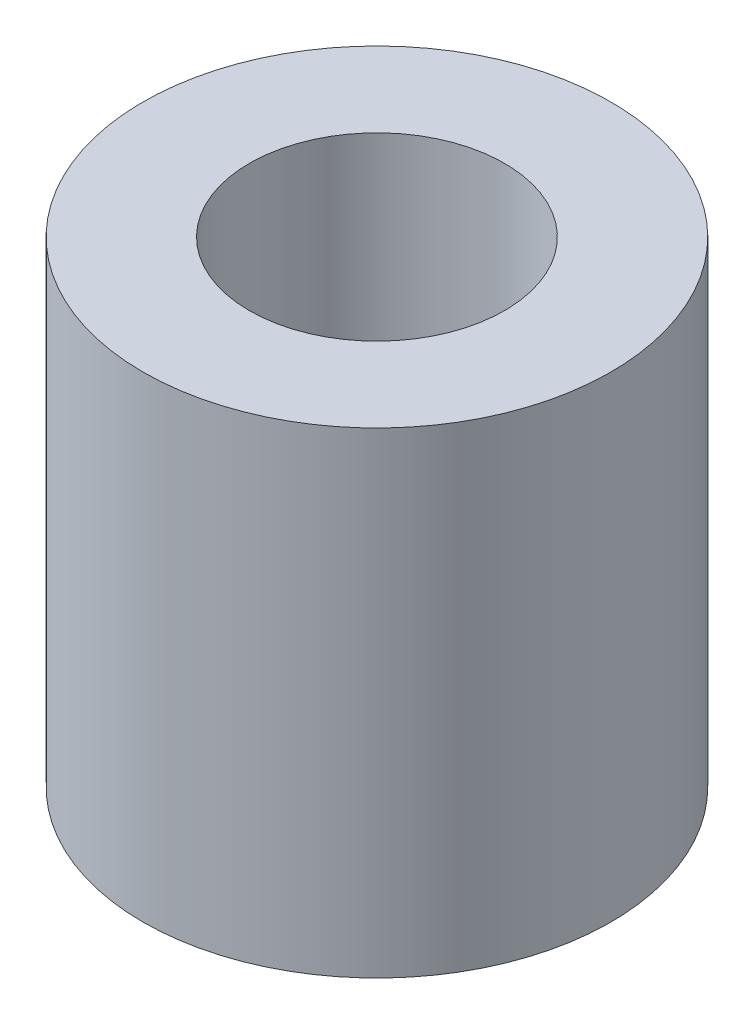
ISO-10303-21;
HEADER;
FILE_DESCRIPTION(('STEP AP214'),'2;1');
FILE_NAME('part.step','',(''),(''),'','','');
FILE_SCHEMA(('AUTOMOTIVE_DESIGN { 1 0 10303 214 1 1 1 1 }'));
ENDSEC;
DATA;
#1=APPLICATION_CONTEXT('core data for automotive mechanical design processes');
#2=APPLICATION_PROTOCOL_DEFINITION('international standard','automotive_design',2000,#1);
#3=PRODUCT_CONTEXT('',#1,'mechanical');
#4=PRODUCT('Part','Part','',(#3));
#5=PRODUCT_RELATED_PRODUCT_CATEGORY('part','',(#4));
#6=PRODUCT_DEFINITION_FORMATION('','',#4);
#7=PRODUCT_DEFINITION_CONTEXT('part definition',#1,'design');
#8=PRODUCT_DEFINITION('design','',#6,#7);
#9=PRODUCT_DEFINITION_SHAPE('','',#8);
#10=(LENGTH_UNIT() NAMED_UNIT(*) SI_UNIT(.MILLI.,.METRE.));
#11=(NAMED_UNIT(*) PLANE_ANGLE_UNIT() SI_UNIT($,.RADIAN.));
#12=(NAMED_UNIT(*) SI_UNIT($,.STERADIAN.) SOLID_ANGLE_UNIT());
#13=UNCERTAINTY_MEASURE_WITH_UNIT(LENGTH_MEASURE(1.E-05),#10,'distance_accuracy_value','');
#14=(GEOMETRIC_REPRESENTATION_CONTEXT(3) GLOBAL_UNCERTAINTY_ASSIGNED_CONTEXT((#13)) GLOBAL_UNIT_ASSIGNED_CONTEXT((#10,
#11,#12)) REPRESENTATION_CONTEXT('',''));
#15=CARTESIAN_POINT('',(0.,0.,0.));
#16=DIRECTION('',(0.,0.,1.));
#17=DIRECTION('',(1.,0.,0.));
#18=AXIS2_PLACEMENT_3D('',#15,#16,#17);
#19=CARTESIAN_POINT('',(0.,5.6,0.));
#20=DIRECTION('',(0.,1.,0.));
#21=DIRECTION('',(0.,0.,1.));
#22=AXIS2_PLACEMENT_3D('',#19,#20,#21);
#23=PLANE('',#22);
#24=CARTESIAN_POINT('',(0.,5.6,0.));
#25=DIRECTION('',(0.,1.,0.));
#26=DIRECTION('',(0.,0.,1.));
#27=AXIS2_PLACEMENT_3D('',#24,#25,#26);
#28=CIRCLE('',#27,2.75);
#29=CARTESIAN_POINT('',(0.,5.6,2.75));
#30=VERTEX_POINT('',#29);
#31=EDGE_CURVE('E10',#30,#30,#28,.T.);
#32=ORIENTED_EDGE('',*,*,#31,.T.);
#33=EDGE_LOOP('',(#32));
#34=FACE_BOUND('',#33,.T.);
#35=CARTESIAN_POINT('',(0.,5.6,0.));
#36=DIRECTION('',(0.,1.,0.));
#37=DIRECTION('',(0.,0.,1.));
#38=AXIS2_PLACEMENT_3D('',#35,#36,#37);
#39=CIRCLE('',#38,1.5);
#40=CARTESIAN_POINT('',(0.,5.6,1.5));
#41=VERTEX_POINT('',#40);
#42=EDGE_CURVE('E41',#41,#41,#39,.T.);
#43=ORIENTED_EDGE('',*,*,#42,.F.);
#44=EDGE_LOOP('',(#43));
#45=FACE_BOUND('',#44,.T.);
#46=ADVANCED_FACE('F30',(#34,#45),#23,.T.);
#47=CARTESIAN_POINT('',(0.,0.,0.));
#48=DIRECTION('',(0.,1.,0.));
#49=DIRECTION('',(0.,0.,1.));
#50=AXIS2_PLACEMENT_3D('',#47,#48,#49);
#51=PLANE('',#50);
#52=CARTESIAN_POINT('',(0.,0.,0.));
#53=DIRECTION('',(0.,1.,0.));
#54=DIRECTION('',(0.,0.,1.));
#55=AXIS2_PLACEMENT_3D('',#52,#53,#54);
#56=CIRCLE('',#55,2.75);
#57=CARTESIAN_POINT('',(0.,0.,2.75));
#58=VERTEX_POINT('',#57);
#59=EDGE_CURVE('E34',#58,#58,#56,.T.);
#60=ORIENTED_EDGE('',*,*,#59,.F.);
#61=EDGE_LOOP('',(#60));
#62=FACE_BOUND('',#61,.T.);
#63=CARTESIAN_POINT('',(0.,0.,0.));
#64=DIRECTION('',(0.,1.,0.));
#65=DIRECTION('',(0.,0.,1.));
#66=AXIS2_PLACEMENT_3D('',#63,#64,#65);
#67=CIRCLE('',#66,1.5);
#68=CARTESIAN_POINT('',(0.,0.,1.5));
#69=VERTEX_POINT('',#68);
#70=EDGE_CURVE('E43',#69,#69,#67,.T.);
#71=ORIENTED_EDGE('',*,*,#70,.T.);
#72=EDGE_LOOP('',(#71));
#73=FACE_BOUND('',#72,.T.);
#74=ADVANCED_FACE('F53',(#62,#73),#51,.F.);
#75=CARTESIAN_POINT('',(0.,5.6,0.));
#76=DIRECTION('',(0.,-1.,0.));
#77=DIRECTION('',(0.,0.,-1.));
#78=AXIS2_PLACEMENT_3D('',#75,#76,#77);
#79=CYLINDRICAL_SURFACE('',#78,2.75);
#80=ORIENTED_EDGE('',*,*,#31,.F.);
#81=EDGE_LOOP('',(#80));
#82=FACE_BOUND('',#81,.T.);
#83=ORIENTED_EDGE('',*,*,#59,.T.);
#84=EDGE_LOOP('',(#83));
#85=FACE_BOUND('',#84,.T.);
#86=ADVANCED_FACE('F32',(#82,#85),#79,.T.);
#87=CARTESIAN_POINT('',(0.,5.6,0.));
#88=DIRECTION('',(0.,-1.,0.));
#89=DIRECTION('',(0.,0.,-1.));
#90=AXIS2_PLACEMENT_3D('',#87,#88,#89);
#91=CYLINDRICAL_SURFACE('',#90,1.5);
#92=ORIENTED_EDGE('',*,*,#42,.T.);
#93=EDGE_LOOP('',(#92));
#94=FACE_BOUND('',#93,.T.);
#95=ORIENTED_EDGE('',*,*,#70,.F.);
#96=EDGE_LOOP('',(#95));
#97=FACE_BOUND('',#96,.T.);
#98=ADVANCED_FACE('F49',(#94,#97),#91,.F.);
#99=CLOSED_SHELL('',(#46,#74,#86,#98));
#100=MANIFOLD_SOLID_BREP('B2',#99);
#101=ADVANCED_BREP_SHAPE_REPRESENTATION('',(#18,#100),#14);
#102=SHAPE_DEFINITION_REPRESENTATION(#9,#101);
ENDSEC;
END-ISO-10303-21;
